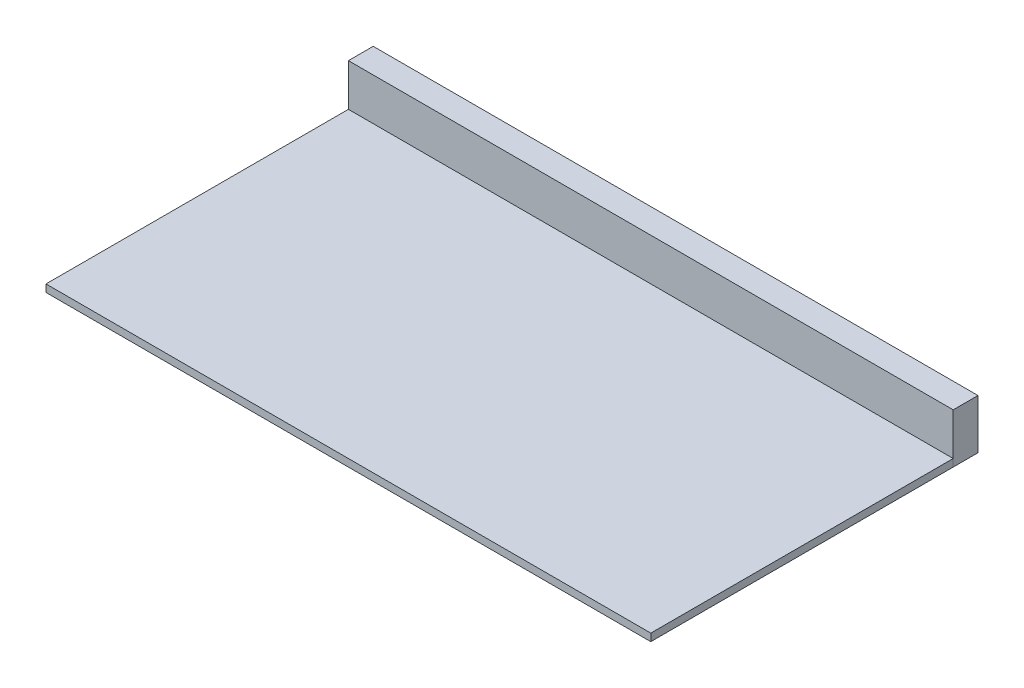
ISO-10303-21;
HEADER;
FILE_DESCRIPTION(('STEP AP214'),'2;1');
FILE_NAME('part.step','',(''),(''),'','','');
FILE_SCHEMA(('AUTOMOTIVE_DESIGN { 1 0 10303 214 1 1 1 1 }'));
ENDSEC;
DATA;
#1=APPLICATION_CONTEXT('core data for automotive mechanical design processes');
#2=APPLICATION_PROTOCOL_DEFINITION('international standard','automotive_design',2000,#1);
#3=PRODUCT_CONTEXT('',#1,'mechanical');
#4=PRODUCT('Part','Part','',(#3));
#5=PRODUCT_RELATED_PRODUCT_CATEGORY('part','',(#4));
#6=PRODUCT_DEFINITION_FORMATION('','',#4);
#7=PRODUCT_DEFINITION_CONTEXT('part definition',#1,'design');
#8=PRODUCT_DEFINITION('design','',#6,#7);
#9=PRODUCT_DEFINITION_SHAPE('','',#8);
#10=(LENGTH_UNIT() NAMED_UNIT(*) SI_UNIT(.MILLI.,.METRE.));
#11=(NAMED_UNIT(*) PLANE_ANGLE_UNIT() SI_UNIT($,.RADIAN.));
#12=(NAMED_UNIT(*) SI_UNIT($,.STERADIAN.) SOLID_ANGLE_UNIT());
#13=UNCERTAINTY_MEASURE_WITH_UNIT(LENGTH_MEASURE(1.E-05),#10,'distance_accuracy_value','');
#14=(GEOMETRIC_REPRESENTATION_CONTEXT(3) GLOBAL_UNCERTAINTY_ASSIGNED_CONTEXT((#13)) GLOBAL_UNIT_ASSIGNED_CONTEXT((#10,
#11,#12)) REPRESENTATION_CONTEXT('',''));
#15=CARTESIAN_POINT('',(0.,0.,0.));
#16=DIRECTION('',(0.,0.,1.));
#17=DIRECTION('',(1.,0.,0.));
#18=AXIS2_PLACEMENT_3D('',#15,#16,#17);
#19=CARTESIAN_POINT('',(0.,200.,-1219.2));
#20=DIRECTION('',(-1.,0.,0.));
#21=DIRECTION('',(0.,0.,1.));
#22=AXIS2_PLACEMENT_3D('',#19,#20,#21);
#23=PLANE('',#22);
#24=DIRECTION('',(0.,0.,-1.));
#25=VECTOR('',#24,1.);
#26=CARTESIAN_POINT('',(0.,0.,-1219.2));
#27=LINE('',#26,#25);
#28=CARTESIAN_POINT('',(0.,0.,-1219.2));
#29=VERTEX_POINT('',#28);
#30=CARTESIAN_POINT('',(0.,0.,-1319.2));
#31=VERTEX_POINT('',#30);
#32=EDGE_CURVE('E115',#29,#31,#27,.T.);
#33=ORIENTED_EDGE('',*,*,#32,.F.);
#34=DIRECTION('',(0.,-1.,0.));
#35=VECTOR('',#34,1.);
#36=CARTESIAN_POINT('',(0.,200.,-1219.2));
#37=LINE('',#36,#35);
#38=CARTESIAN_POINT('',(0.,200.,-1219.2));
#39=VERTEX_POINT('',#38);
#40=EDGE_CURVE('E12',#39,#29,#37,.T.);
#41=ORIENTED_EDGE('',*,*,#40,.F.);
#42=DIRECTION('',(0.,0.,-1.));
#43=VECTOR('',#42,1.);
#44=CARTESIAN_POINT('',(0.,200.,-1219.2));
#45=LINE('',#44,#43);
#46=CARTESIAN_POINT('',(0.,200.,-1319.2));
#47=VERTEX_POINT('',#46);
#48=EDGE_CURVE('E109',#39,#47,#45,.T.);
#49=ORIENTED_EDGE('',*,*,#48,.T.);
#50=DIRECTION('',(0.,-1.,0.));
#51=VECTOR('',#50,1.);
#52=CARTESIAN_POINT('',(0.,200.,-1319.2));
#53=LINE('',#52,#51);
#54=EDGE_CURVE('E54',#47,#31,#53,.T.);
#55=ORIENTED_EDGE('',*,*,#54,.T.);
#56=EDGE_LOOP('',(#33,#41,#49,#55));
#57=FACE_BOUND('',#56,.T.);
#58=ADVANCED_FACE('F51',(#57),#23,.T.);
#59=CARTESIAN_POINT('',(0.,200.,-1219.2));
#60=DIRECTION('',(0.,0.,1.));
#61=DIRECTION('',(1.,0.,0.));
#62=AXIS2_PLACEMENT_3D('',#59,#60,#61);
#63=PLANE('',#62);
#64=DIRECTION('',(-1.,0.,0.));
#65=VECTOR('',#64,1.);
#66=CARTESIAN_POINT('',(0.,0.,-1219.2));
#67=LINE('',#66,#65);
#68=CARTESIAN_POINT('',(2438.4,0.,-1219.2));
#69=VERTEX_POINT('',#68);
#70=EDGE_CURVE('E111',#69,#29,#67,.T.);
#71=ORIENTED_EDGE('',*,*,#70,.F.);
#72=DIRECTION('',(0.,-1.,0.));
#73=VECTOR('',#72,1.);
#74=CARTESIAN_POINT('',(2438.4,200.,-1219.2));
#75=LINE('',#74,#73);
#76=CARTESIAN_POINT('',(2438.4,200.,-1219.2));
#77=VERTEX_POINT('',#76);
#78=EDGE_CURVE('E60',#77,#69,#75,.T.);
#79=ORIENTED_EDGE('',*,*,#78,.F.);
#80=DIRECTION('',(-1.,0.,0.));
#81=VECTOR('',#80,1.);
#82=CARTESIAN_POINT('',(0.,200.,-1219.2));
#83=LINE('',#82,#81);
#84=EDGE_CURVE('E106',#77,#39,#83,.T.);
#85=ORIENTED_EDGE('',*,*,#84,.T.);
#86=ORIENTED_EDGE('',*,*,#40,.T.);
#87=EDGE_LOOP('',(#71,#79,#85,#86));
#88=FACE_BOUND('',#87,.T.);
#89=ADVANCED_FACE('F125',(#88),#63,.T.);
#90=CARTESIAN_POINT('',(2438.4,200.,-1219.2));
#91=DIRECTION('',(1.,0.,0.));
#92=DIRECTION('',(0.,0.,-1.));
#93=AXIS2_PLACEMENT_3D('',#90,#91,#92);
#94=PLANE('',#93);
#95=DIRECTION('',(0.,0.,1.));
#96=VECTOR('',#95,1.);
#97=CARTESIAN_POINT('',(2438.4,0.,-1219.2));
#98=LINE('',#97,#96);
#99=CARTESIAN_POINT('',(2438.4,0.,-1319.2));
#100=VERTEX_POINT('',#99);
#101=EDGE_CURVE('E101',#100,#69,#98,.T.);
#102=ORIENTED_EDGE('',*,*,#101,.F.);
#103=DIRECTION('',(0.,-1.,0.));
#104=VECTOR('',#103,1.);
#105=CARTESIAN_POINT('',(2438.4,200.,-1319.2));
#106=LINE('',#105,#104);
#107=CARTESIAN_POINT('',(2438.4,200.,-1319.2));
#108=VERTEX_POINT('',#107);
#109=EDGE_CURVE('E96',#108,#100,#106,.T.);
#110=ORIENTED_EDGE('',*,*,#109,.F.);
#111=DIRECTION('',(0.,0.,1.));
#112=VECTOR('',#111,1.);
#113=CARTESIAN_POINT('',(2438.4,200.,-1219.2));
#114=LINE('',#113,#112);
#115=EDGE_CURVE('E99',#108,#77,#114,.T.);
#116=ORIENTED_EDGE('',*,*,#115,.T.);
#117=ORIENTED_EDGE('',*,*,#78,.T.);
#118=EDGE_LOOP('',(#102,#110,#116,#117));
#119=FACE_BOUND('',#118,.T.);
#120=ADVANCED_FACE('F98',(#119),#94,.T.);
#121=CARTESIAN_POINT('',(0.,200.,-1319.2));
#122=DIRECTION('',(0.,0.,-1.));
#123=DIRECTION('',(-1.,0.,0.));
#124=AXIS2_PLACEMENT_3D('',#121,#122,#123);
#125=PLANE('',#124);
#126=DIRECTION('',(1.,0.,0.));
#127=VECTOR('',#126,1.);
#128=CARTESIAN_POINT('',(0.,0.,-1319.2));
#129=LINE('',#128,#127);
#130=EDGE_CURVE('E118',#31,#100,#129,.T.);
#131=ORIENTED_EDGE('',*,*,#130,.F.);
#132=ORIENTED_EDGE('',*,*,#54,.F.);
#133=DIRECTION('',(1.,0.,0.));
#134=VECTOR('',#133,1.);
#135=CARTESIAN_POINT('',(0.,200.,-1319.2));
#136=LINE('',#135,#134);
#137=EDGE_CURVE('E105',#47,#108,#136,.T.);
#138=ORIENTED_EDGE('',*,*,#137,.T.);
#139=ORIENTED_EDGE('',*,*,#109,.T.);
#140=EDGE_LOOP('',(#131,#132,#138,#139));
#141=FACE_BOUND('',#140,.T.);
#142=ADVANCED_FACE('F108',(#141),#125,.T.);
#143=CARTESIAN_POINT('',(0.,200.,0.));
#144=DIRECTION('',(0.,-1.,0.));
#145=DIRECTION('',(0.,0.,-1.));
#146=AXIS2_PLACEMENT_3D('',#143,#144,#145);
#147=PLANE('',#146);
#148=ORIENTED_EDGE('',*,*,#48,.F.);
#149=ORIENTED_EDGE('',*,*,#84,.F.);
#150=ORIENTED_EDGE('',*,*,#115,.F.);
#151=ORIENTED_EDGE('',*,*,#137,.F.);
#152=EDGE_LOOP('',(#148,#149,#150,#151));
#153=FACE_BOUND('',#152,.T.);
#154=ADVANCED_FACE('F104',(#153),#147,.F.);
#155=CARTESIAN_POINT('',(0.,0.,0.));
#156=DIRECTION('',(0.,-1.,0.));
#157=DIRECTION('',(0.,0.,-1.));
#158=AXIS2_PLACEMENT_3D('',#155,#156,#157);
#159=PLANE('',#158);
#160=ORIENTED_EDGE('',*,*,#32,.T.);
#161=ORIENTED_EDGE('',*,*,#130,.T.);
#162=ORIENTED_EDGE('',*,*,#101,.T.);
#163=ORIENTED_EDGE('',*,*,#70,.T.);
#164=EDGE_LOOP('',(#160,#161,#162,#163));
#165=FACE_BOUND('',#164,.T.);
#166=ADVANCED_FACE('F124',(#165),#159,.T.);
#167=CLOSED_SHELL('',(#58,#89,#120,#142,#154,#166));
#168=MANIFOLD_SOLID_BREP('B2',#167);
#169=CARTESIAN_POINT('',(0.,30.,0.));
#170=DIRECTION('',(1.,0.,0.));
#171=DIRECTION('',(0.,0.,-1.));
#172=AXIS2_PLACEMENT_3D('',#169,#170,#171);
#173=PLANE('',#172);
#174=DIRECTION('',(0.,0.,1.));
#175=VECTOR('',#174,1.);
#176=CARTESIAN_POINT('',(0.,0.,0.));
#177=LINE('',#176,#175);
#178=CARTESIAN_POINT('',(0.,0.,-1219.2));
#179=VERTEX_POINT('',#178);
#180=CARTESIAN_POINT('',(0.,0.,0.));
#181=VERTEX_POINT('',#180);
#182=EDGE_CURVE('E243',#179,#181,#177,.T.);
#183=ORIENTED_EDGE('',*,*,#182,.T.);
#184=DIRECTION('',(0.,-1.,0.));
#185=VECTOR('',#184,1.);
#186=CARTESIAN_POINT('',(0.,30.,0.));
#187=LINE('',#186,#185);
#188=CARTESIAN_POINT('',(0.,30.,0.));
#189=VERTEX_POINT('',#188);
#190=EDGE_CURVE('E49',#189,#181,#187,.T.);
#191=ORIENTED_EDGE('',*,*,#190,.F.);
#192=DIRECTION('',(0.,0.,1.));
#193=VECTOR('',#192,1.);
#194=CARTESIAN_POINT('',(0.,30.,0.));
#195=LINE('',#194,#193);
#196=CARTESIAN_POINT('',(0.,30.,-1219.2));
#197=VERTEX_POINT('',#196);
#198=EDGE_CURVE('E227',#197,#189,#195,.T.);
#199=ORIENTED_EDGE('',*,*,#198,.F.);
#200=DIRECTION('',(0.,-1.,0.));
#201=VECTOR('',#200,1.);
#202=CARTESIAN_POINT('',(0.,30.,-1219.2));
#203=LINE('',#202,#201);
#204=EDGE_CURVE('E239',#197,#179,#203,.T.);
#205=ORIENTED_EDGE('',*,*,#204,.T.);
#206=EDGE_LOOP('',(#183,#191,#199,#205));
#207=FACE_BOUND('',#206,.T.);
#208=ADVANCED_FACE('F175',(#207),#173,.F.);
#209=CARTESIAN_POINT('',(0.,30.,0.));
#210=DIRECTION('',(0.,0.,-1.));
#211=DIRECTION('',(-1.,0.,0.));
#212=AXIS2_PLACEMENT_3D('',#209,#210,#211);
#213=PLANE('',#212);
#214=DIRECTION('',(1.,0.,0.));
#215=VECTOR('',#214,1.);
#216=CARTESIAN_POINT('',(0.,0.,0.));
#217=LINE('',#216,#215);
#218=CARTESIAN_POINT('',(2438.4,0.,0.));
#219=VERTEX_POINT('',#218);
#220=EDGE_CURVE('E232',#181,#219,#217,.T.);
#221=ORIENTED_EDGE('',*,*,#220,.T.);
#222=DIRECTION('',(0.,-1.,0.));
#223=VECTOR('',#222,1.);
#224=CARTESIAN_POINT('',(2438.4,30.,0.));
#225=LINE('',#224,#223);
#226=CARTESIAN_POINT('',(2438.4,30.,0.));
#227=VERTEX_POINT('',#226);
#228=EDGE_CURVE('E184',#227,#219,#225,.T.);
#229=ORIENTED_EDGE('',*,*,#228,.F.);
#230=DIRECTION('',(1.,0.,0.));
#231=VECTOR('',#230,1.);
#232=CARTESIAN_POINT('',(0.,30.,0.));
#233=LINE('',#232,#231);
#234=EDGE_CURVE('E222',#189,#227,#233,.T.);
#235=ORIENTED_EDGE('',*,*,#234,.F.);
#236=ORIENTED_EDGE('',*,*,#190,.T.);
#237=EDGE_LOOP('',(#221,#229,#235,#236));
#238=FACE_BOUND('',#237,.T.);
#239=ADVANCED_FACE('F231',(#238),#213,.F.);
#240=CARTESIAN_POINT('',(2438.4,30.,0.));
#241=DIRECTION('',(-1.,0.,0.));
#242=DIRECTION('',(0.,0.,1.));
#243=AXIS2_PLACEMENT_3D('',#240,#241,#242);
#244=PLANE('',#243);
#245=DIRECTION('',(0.,0.,-1.));
#246=VECTOR('',#245,1.);
#247=CARTESIAN_POINT('',(2438.4,0.,0.));
#248=LINE('',#247,#246);
#249=CARTESIAN_POINT('',(2438.4,0.,-1219.2));
#250=VERTEX_POINT('',#249);
#251=EDGE_CURVE('E209',#219,#250,#248,.T.);
#252=ORIENTED_EDGE('',*,*,#251,.T.);
#253=DIRECTION('',(0.,-1.,0.));
#254=VECTOR('',#253,1.);
#255=CARTESIAN_POINT('',(2438.4,30.,-1219.2));
#256=LINE('',#255,#254);
#257=CARTESIAN_POINT('',(2438.4,30.,-1219.2));
#258=VERTEX_POINT('',#257);
#259=EDGE_CURVE('E234',#258,#250,#256,.T.);
#260=ORIENTED_EDGE('',*,*,#259,.F.);
#261=DIRECTION('',(0.,0.,-1.));
#262=VECTOR('',#261,1.);
#263=CARTESIAN_POINT('',(2438.4,30.,0.));
#264=LINE('',#263,#262);
#265=EDGE_CURVE('E225',#227,#258,#264,.T.);
#266=ORIENTED_EDGE('',*,*,#265,.F.);
#267=ORIENTED_EDGE('',*,*,#228,.T.);
#268=EDGE_LOOP('',(#252,#260,#266,#267));
#269=FACE_BOUND('',#268,.T.);
#270=ADVANCED_FACE('F235',(#269),#244,.F.);
#271=CARTESIAN_POINT('',(0.,30.,-1219.2));
#272=DIRECTION('',(0.,0.,1.));
#273=DIRECTION('',(1.,0.,0.));
#274=AXIS2_PLACEMENT_3D('',#271,#272,#273);
#275=PLANE('',#274);
#276=DIRECTION('',(-1.,0.,0.));
#277=VECTOR('',#276,1.);
#278=CARTESIAN_POINT('',(0.,0.,-1219.2));
#279=LINE('',#278,#277);
#280=EDGE_CURVE('E215',#250,#179,#279,.T.);
#281=ORIENTED_EDGE('',*,*,#280,.T.);
#282=ORIENTED_EDGE('',*,*,#204,.F.);
#283=DIRECTION('',(-1.,0.,0.));
#284=VECTOR('',#283,1.);
#285=CARTESIAN_POINT('',(0.,30.,-1219.2));
#286=LINE('',#285,#284);
#287=EDGE_CURVE('E192',#258,#197,#286,.T.);
#288=ORIENTED_EDGE('',*,*,#287,.F.);
#289=ORIENTED_EDGE('',*,*,#259,.T.);
#290=EDGE_LOOP('',(#281,#282,#288,#289));
#291=FACE_BOUND('',#290,.T.);
#292=ADVANCED_FACE('F256',(#291),#275,.F.);
#293=CARTESIAN_POINT('',(0.,30.,0.));
#294=DIRECTION('',(0.,-1.,0.));
#295=DIRECTION('',(0.,0.,-1.));
#296=AXIS2_PLACEMENT_3D('',#293,#294,#295);
#297=PLANE('',#296);
#298=ORIENTED_EDGE('',*,*,#198,.T.);
#299=ORIENTED_EDGE('',*,*,#234,.T.);
#300=ORIENTED_EDGE('',*,*,#265,.T.);
#301=ORIENTED_EDGE('',*,*,#287,.T.);
#302=EDGE_LOOP('',(#298,#299,#300,#301));
#303=FACE_BOUND('',#302,.T.);
#304=ADVANCED_FACE('F223',(#303),#297,.F.);
#305=CARTESIAN_POINT('',(0.,0.,0.));
#306=DIRECTION('',(0.,-1.,0.));
#307=DIRECTION('',(0.,0.,-1.));
#308=AXIS2_PLACEMENT_3D('',#305,#306,#307);
#309=PLANE('',#308);
#310=ORIENTED_EDGE('',*,*,#182,.F.);
#311=ORIENTED_EDGE('',*,*,#280,.F.);
#312=ORIENTED_EDGE('',*,*,#251,.F.);
#313=ORIENTED_EDGE('',*,*,#220,.F.);
#314=EDGE_LOOP('',(#310,#311,#312,#313));
#315=FACE_BOUND('',#314,.T.);
#316=ADVANCED_FACE('F259',(#315),#309,.T.);
#317=CLOSED_SHELL('',(#208,#239,#270,#292,#304,#316));
#318=MANIFOLD_SOLID_BREP('B6',#317);
#319=ADVANCED_BREP_SHAPE_REPRESENTATION('',(#18,#168,#318),#14);
#320=SHAPE_DEFINITION_REPRESENTATION(#9,#319);
ENDSEC;
END-ISO-10303-21;
